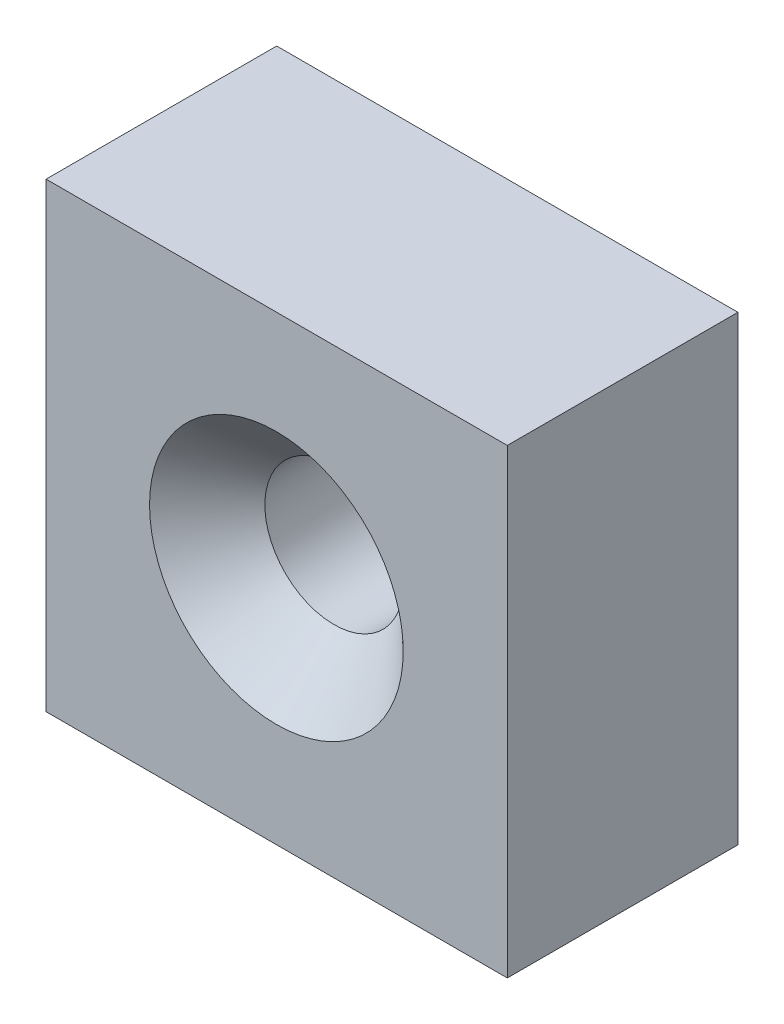
ISO-10303-21;
HEADER;
FILE_DESCRIPTION(('STEP AP214'),'2;1');
FILE_NAME('part.step','',(''),(''),'','','');
FILE_SCHEMA(('AUTOMOTIVE_DESIGN { 1 0 10303 214 1 1 1 1 }'));
ENDSEC;
DATA;
#1=APPLICATION_CONTEXT('core data for automotive mechanical design processes');
#2=APPLICATION_PROTOCOL_DEFINITION('international standard','automotive_design',2000,#1);
#3=PRODUCT_CONTEXT('',#1,'mechanical');
#4=PRODUCT('Part','Part','',(#3));
#5=PRODUCT_RELATED_PRODUCT_CATEGORY('part','',(#4));
#6=PRODUCT_DEFINITION_FORMATION('','',#4);
#7=PRODUCT_DEFINITION_CONTEXT('part definition',#1,'design');
#8=PRODUCT_DEFINITION('design','',#6,#7);
#9=PRODUCT_DEFINITION_SHAPE('','',#8);
#10=(LENGTH_UNIT() NAMED_UNIT(*) SI_UNIT(.MILLI.,.METRE.));
#11=(NAMED_UNIT(*) PLANE_ANGLE_UNIT() SI_UNIT($,.RADIAN.));
#12=(NAMED_UNIT(*) SI_UNIT($,.STERADIAN.) SOLID_ANGLE_UNIT());
#13=UNCERTAINTY_MEASURE_WITH_UNIT(LENGTH_MEASURE(1.E-05),#10,'distance_accuracy_value','');
#14=(GEOMETRIC_REPRESENTATION_CONTEXT(3) GLOBAL_UNCERTAINTY_ASSIGNED_CONTEXT((#13)) GLOBAL_UNIT_ASSIGNED_CONTEXT((#10,
#11,#12)) REPRESENTATION_CONTEXT('',''));
#15=CARTESIAN_POINT('',(0.,0.,0.));
#16=DIRECTION('',(0.,0.,1.));
#17=DIRECTION('',(1.,0.,0.));
#18=AXIS2_PLACEMENT_3D('',#15,#16,#17);
#19=CARTESIAN_POINT('',(0.,0.,10.));
#20=DIRECTION('',(1.,0.,0.));
#21=DIRECTION('',(0.,0.,-1.));
#22=AXIS2_PLACEMENT_3D('',#19,#20,#21);
#23=PLANE('',#22);
#24=DIRECTION('',(0.,-1.,0.));
#25=VECTOR('',#24,1.);
#26=CARTESIAN_POINT('',(0.,0.,0.));
#27=LINE('',#26,#25);
#28=CARTESIAN_POINT('',(0.,20.,0.));
#29=VERTEX_POINT('',#28);
#30=CARTESIAN_POINT('',(0.,0.,0.));
#31=VERTEX_POINT('',#30);
#32=EDGE_CURVE('E105',#29,#31,#27,.T.);
#33=ORIENTED_EDGE('',*,*,#32,.T.);
#34=DIRECTION('',(0.,0.,-1.));
#35=VECTOR('',#34,1.);
#36=CARTESIAN_POINT('',(0.,0.,10.));
#37=LINE('',#36,#35);
#38=CARTESIAN_POINT('',(0.,0.,10.));
#39=VERTEX_POINT('',#38);
#40=EDGE_CURVE('E11',#39,#31,#37,.T.);
#41=ORIENTED_EDGE('',*,*,#40,.F.);
#42=DIRECTION('',(0.,-1.,0.));
#43=VECTOR('',#42,1.);
#44=CARTESIAN_POINT('',(0.,0.,10.));
#45=LINE('',#44,#43);
#46=CARTESIAN_POINT('',(0.,20.,10.));
#47=VERTEX_POINT('',#46);
#48=EDGE_CURVE('E89',#47,#39,#45,.T.);
#49=ORIENTED_EDGE('',*,*,#48,.F.);
#50=DIRECTION('',(0.,0.,-1.));
#51=VECTOR('',#50,1.);
#52=CARTESIAN_POINT('',(0.,20.,10.));
#53=LINE('',#52,#51);
#54=EDGE_CURVE('E98',#47,#29,#53,.T.);
#55=ORIENTED_EDGE('',*,*,#54,.T.);
#56=EDGE_LOOP('',(#33,#41,#49,#55));
#57=FACE_BOUND('',#56,.T.);
#58=ADVANCED_FACE('F39',(#57),#23,.F.);
#59=CARTESIAN_POINT('',(0.,0.,10.));
#60=DIRECTION('',(0.,1.,0.));
#61=DIRECTION('',(0.,0.,1.));
#62=AXIS2_PLACEMENT_3D('',#59,#60,#61);
#63=PLANE('',#62);
#64=DIRECTION('',(1.,0.,0.));
#65=VECTOR('',#64,1.);
#66=CARTESIAN_POINT('',(0.,0.,0.));
#67=LINE('',#66,#65);
#68=CARTESIAN_POINT('',(20.,0.,0.));
#69=VERTEX_POINT('',#68);
#70=EDGE_CURVE('E94',#31,#69,#67,.T.);
#71=ORIENTED_EDGE('',*,*,#70,.T.);
#72=DIRECTION('',(0.,0.,-1.));
#73=VECTOR('',#72,1.);
#74=CARTESIAN_POINT('',(20.,0.,10.));
#75=LINE('',#74,#73);
#76=CARTESIAN_POINT('',(20.,0.,10.));
#77=VERTEX_POINT('',#76);
#78=EDGE_CURVE('E50',#77,#69,#75,.T.);
#79=ORIENTED_EDGE('',*,*,#78,.F.);
#80=DIRECTION('',(1.,0.,0.));
#81=VECTOR('',#80,1.);
#82=CARTESIAN_POINT('',(0.,0.,10.));
#83=LINE('',#82,#81);
#84=EDGE_CURVE('E85',#39,#77,#83,.T.);
#85=ORIENTED_EDGE('',*,*,#84,.F.);
#86=ORIENTED_EDGE('',*,*,#40,.T.);
#87=EDGE_LOOP('',(#71,#79,#85,#86));
#88=FACE_BOUND('',#87,.T.);
#89=ADVANCED_FACE('F91',(#88),#63,.F.);
#90=CARTESIAN_POINT('',(20.,0.,10.));
#91=DIRECTION('',(-1.,0.,0.));
#92=DIRECTION('',(0.,0.,1.));
#93=AXIS2_PLACEMENT_3D('',#90,#91,#92);
#94=PLANE('',#93);
#95=DIRECTION('',(0.,1.,0.));
#96=VECTOR('',#95,1.);
#97=CARTESIAN_POINT('',(20.,0.,0.));
#98=LINE('',#97,#96);
#99=CARTESIAN_POINT('',(20.,20.,0.));
#100=VERTEX_POINT('',#99);
#101=EDGE_CURVE('E75',#69,#100,#98,.T.);
#102=ORIENTED_EDGE('',*,*,#101,.T.);
#103=DIRECTION('',(0.,0.,-1.));
#104=VECTOR('',#103,1.);
#105=CARTESIAN_POINT('',(20.,20.,10.));
#106=LINE('',#105,#104);
#107=CARTESIAN_POINT('',(20.,20.,10.));
#108=VERTEX_POINT('',#107);
#109=EDGE_CURVE('E92',#108,#100,#106,.T.);
#110=ORIENTED_EDGE('',*,*,#109,.F.);
#111=DIRECTION('',(0.,1.,0.));
#112=VECTOR('',#111,1.);
#113=CARTESIAN_POINT('',(20.,0.,10.));
#114=LINE('',#113,#112);
#115=EDGE_CURVE('E86',#77,#108,#114,.T.);
#116=ORIENTED_EDGE('',*,*,#115,.F.);
#117=ORIENTED_EDGE('',*,*,#78,.T.);
#118=EDGE_LOOP('',(#102,#110,#116,#117));
#119=FACE_BOUND('',#118,.T.);
#120=ADVANCED_FACE('F96',(#119),#94,.F.);
#121=CARTESIAN_POINT('',(0.,20.,10.));
#122=DIRECTION('',(0.,-1.,0.));
#123=DIRECTION('',(0.,0.,-1.));
#124=AXIS2_PLACEMENT_3D('',#121,#122,#123);
#125=PLANE('',#124);
#126=DIRECTION('',(-1.,0.,0.));
#127=VECTOR('',#126,1.);
#128=CARTESIAN_POINT('',(0.,20.,0.));
#129=LINE('',#128,#127);
#130=EDGE_CURVE('E77',#100,#29,#129,.T.);
#131=ORIENTED_EDGE('',*,*,#130,.T.);
#132=ORIENTED_EDGE('',*,*,#54,.F.);
#133=DIRECTION('',(-1.,0.,0.));
#134=VECTOR('',#133,1.);
#135=CARTESIAN_POINT('',(0.,20.,10.));
#136=LINE('',#135,#134);
#137=EDGE_CURVE('E54',#108,#47,#136,.T.);
#138=ORIENTED_EDGE('',*,*,#137,.F.);
#139=ORIENTED_EDGE('',*,*,#109,.T.);
#140=EDGE_LOOP('',(#131,#132,#138,#139));
#141=FACE_BOUND('',#140,.T.);
#142=ADVANCED_FACE('F109',(#141),#125,.F.);
#143=CARTESIAN_POINT('',(0.,0.,10.));
#144=DIRECTION('',(0.,0.,-1.));
#145=DIRECTION('',(-1.,0.,0.));
#146=AXIS2_PLACEMENT_3D('',#143,#144,#145);
#147=PLANE('',#146);
#148=CARTESIAN_POINT('',(9.98648737498797,10.0143055988724,10.));
#149=DIRECTION('',(0.,0.,1.));
#150=DIRECTION('',(1.,0.,0.));
#151=AXIS2_PLACEMENT_3D('',#148,#149,#150);
#152=CIRCLE('',#151,5.5);
#153=CARTESIAN_POINT('',(15.486487374988,10.0143055988724,10.));
#154=VERTEX_POINT('',#153);
#155=EDGE_CURVE('E121',#154,#154,#152,.T.);
#156=ORIENTED_EDGE('',*,*,#155,.F.);
#157=EDGE_LOOP('',(#156));
#158=FACE_BOUND('',#157,.T.);
#159=ORIENTED_EDGE('',*,*,#48,.T.);
#160=ORIENTED_EDGE('',*,*,#84,.T.);
#161=ORIENTED_EDGE('',*,*,#115,.T.);
#162=ORIENTED_EDGE('',*,*,#137,.T.);
#163=EDGE_LOOP('',(#159,#160,#161,#162));
#164=FACE_BOUND('',#163,.T.);
#165=ADVANCED_FACE('F88',(#158,#164),#147,.F.);
#166=CARTESIAN_POINT('',(0.,0.,0.));
#167=DIRECTION('',(0.,0.,-1.));
#168=DIRECTION('',(-1.,0.,0.));
#169=AXIS2_PLACEMENT_3D('',#166,#167,#168);
#170=PLANE('',#169);
#171=CARTESIAN_POINT('',(9.98648737498797,10.0143055988724,0.));
#172=DIRECTION('',(0.,0.,1.));
#173=DIRECTION('',(1.,0.,0.));
#174=AXIS2_PLACEMENT_3D('',#171,#172,#173);
#175=CIRCLE('',#174,2.99999999999999);
#176=CARTESIAN_POINT('',(12.986487374988,10.0143055988724,0.));
#177=VERTEX_POINT('',#176);
#178=EDGE_CURVE('E104',#177,#177,#175,.T.);
#179=ORIENTED_EDGE('',*,*,#178,.T.);
#180=EDGE_LOOP('',(#179));
#181=FACE_BOUND('',#180,.T.);
#182=ORIENTED_EDGE('',*,*,#32,.F.);
#183=ORIENTED_EDGE('',*,*,#130,.F.);
#184=ORIENTED_EDGE('',*,*,#101,.F.);
#185=ORIENTED_EDGE('',*,*,#70,.F.);
#186=EDGE_LOOP('',(#182,#183,#184,#185));
#187=FACE_BOUND('',#186,.T.);
#188=ADVANCED_FACE('F114',(#181,#187),#170,.T.);
#189=CARTESIAN_POINT('',(9.98648737498797,10.0143055988724,10.));
#190=DIRECTION('',(0.,0.,1.));
#191=DIRECTION('',(1.,0.,0.));
#192=AXIS2_PLACEMENT_3D('',#189,#190,#191);
#193=CYLINDRICAL_SURFACE('',#192,2.99999999999999);
#194=ORIENTED_EDGE('',*,*,#178,.F.);
#195=EDGE_LOOP('',(#194));
#196=FACE_BOUND('',#195,.T.);
#197=CARTESIAN_POINT('',(9.98648737498797,10.0143055988724,7.49999999999998));
#198=DIRECTION('',(0.,0.,1.));
#199=DIRECTION('',(1.,0.,0.));
#200=AXIS2_PLACEMENT_3D('',#197,#198,#199);
#201=CIRCLE('',#200,2.99999999999999);
#202=CARTESIAN_POINT('',(12.986487374988,10.0143055988724,7.49999999999998));
#203=VERTEX_POINT('',#202);
#204=EDGE_CURVE('E117',#203,#203,#201,.T.);
#205=ORIENTED_EDGE('',*,*,#204,.T.);
#206=EDGE_LOOP('',(#205));
#207=FACE_BOUND('',#206,.T.);
#208=ADVANCED_FACE('F132',(#196,#207),#193,.F.);
#209=CARTESIAN_POINT('',(9.98648737498797,10.0143055988724,10.));
#210=DIRECTION('',(0.,0.,1.));
#211=DIRECTION('',(1.,0.,0.));
#212=AXIS2_PLACEMENT_3D('',#209,#210,#211);
#213=CONICAL_SURFACE('',#212,5.5,0.785398163397447);
#214=ORIENTED_EDGE('',*,*,#204,.F.);
#215=EDGE_LOOP('',(#214));
#216=FACE_BOUND('',#215,.T.);
#217=ORIENTED_EDGE('',*,*,#155,.T.);
#218=EDGE_LOOP('',(#217));
#219=FACE_BOUND('',#218,.T.);
#220=ADVANCED_FACE('F125',(#216,#219),#213,.F.);
#221=CLOSED_SHELL('',(#58,#89,#120,#142,#165,#188,#208,#220));
#222=MANIFOLD_SOLID_BREP('B2',#221);
#223=ADVANCED_BREP_SHAPE_REPRESENTATION('',(#18,#222),#14);
#224=SHAPE_DEFINITION_REPRESENTATION(#9,#223);
ENDSEC;
END-ISO-10303-21;
